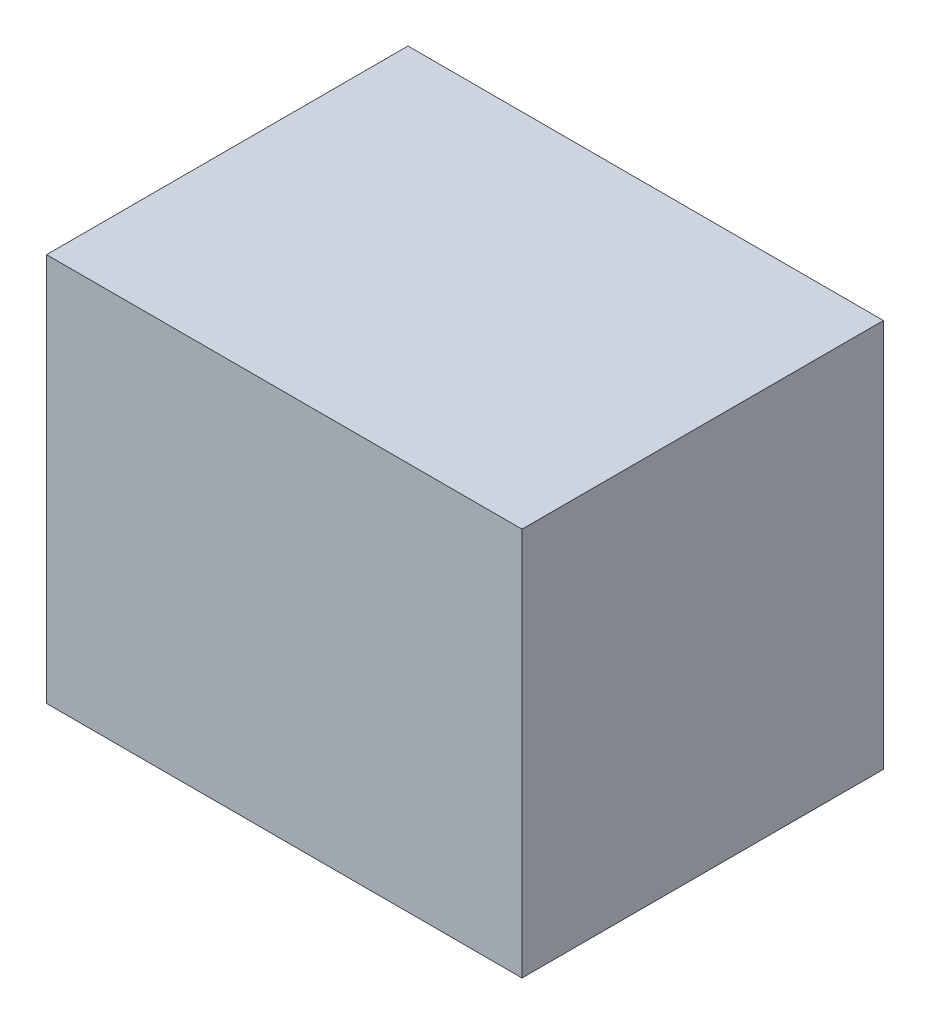
ISO-10303-21;
HEADER;
FILE_DESCRIPTION(('STEP AP214'),'2;1');
FILE_NAME('part.step','',(''),(''),'','','');
FILE_SCHEMA(('AUTOMOTIVE_DESIGN { 1 0 10303 214 1 1 1 1 }'));
ENDSEC;
DATA;
#1=APPLICATION_CONTEXT('core data for automotive mechanical design processes');
#2=APPLICATION_PROTOCOL_DEFINITION('international standard','automotive_design',2000,#1);
#3=PRODUCT_CONTEXT('',#1,'mechanical');
#4=PRODUCT('Part','Part','',(#3));
#5=PRODUCT_RELATED_PRODUCT_CATEGORY('part','',(#4));
#6=PRODUCT_DEFINITION_FORMATION('','',#4);
#7=PRODUCT_DEFINITION_CONTEXT('part definition',#1,'design');
#8=PRODUCT_DEFINITION('design','',#6,#7);
#9=PRODUCT_DEFINITION_SHAPE('','',#8);
#10=(LENGTH_UNIT() NAMED_UNIT(*) SI_UNIT(.MILLI.,.METRE.));
#11=(NAMED_UNIT(*) PLANE_ANGLE_UNIT() SI_UNIT($,.RADIAN.));
#12=(NAMED_UNIT(*) SI_UNIT($,.STERADIAN.) SOLID_ANGLE_UNIT());
#13=UNCERTAINTY_MEASURE_WITH_UNIT(LENGTH_MEASURE(1.E-05),#10,'distance_accuracy_value','');
#14=(GEOMETRIC_REPRESENTATION_CONTEXT(3) GLOBAL_UNCERTAINTY_ASSIGNED_CONTEXT((#13)) GLOBAL_UNIT_ASSIGNED_CONTEXT((#10,
#11,#12)) REPRESENTATION_CONTEXT('',''));
#15=CARTESIAN_POINT('',(0.,0.,0.));
#16=DIRECTION('',(0.,0.,1.));
#17=DIRECTION('',(1.,0.,0.));
#18=AXIS2_PLACEMENT_3D('',#15,#16,#17);
#19=CARTESIAN_POINT('',(214.287747770194,242.,-69.0975551898418));
#20=DIRECTION('',(-1.,0.,0.));
#21=DIRECTION('',(0.,0.,1.));
#22=AXIS2_PLACEMENT_3D('',#19,#20,#21);
#23=PLANE('',#22);
#24=DIRECTION('',(0.,0.,-1.));
#25=VECTOR('',#24,1.);
#26=CARTESIAN_POINT('',(214.287747770194,0.,-69.0975551898418));
#27=LINE('',#26,#25);
#28=CARTESIAN_POINT('',(214.287747770194,0.,155.902444810158));
#29=VERTEX_POINT('',#28);
#30=CARTESIAN_POINT('',(214.287747770194,0.,-69.0975551898418));
#31=VERTEX_POINT('',#30);
#32=EDGE_CURVE('E96',#29,#31,#27,.T.);
#33=ORIENTED_EDGE('',*,*,#32,.T.);
#34=DIRECTION('',(0.,-1.,0.));
#35=VECTOR('',#34,1.);
#36=CARTESIAN_POINT('',(214.287747770194,242.,-69.0975551898418));
#37=LINE('',#36,#35);
#38=CARTESIAN_POINT('',(214.287747770194,242.,-69.0975551898418));
#39=VERTEX_POINT('',#38);
#40=EDGE_CURVE('E11',#39,#31,#37,.T.);
#41=ORIENTED_EDGE('',*,*,#40,.F.);
#42=DIRECTION('',(0.,0.,-1.));
#43=VECTOR('',#42,1.);
#44=CARTESIAN_POINT('',(214.287747770194,242.,-69.0975551898418));
#45=LINE('',#44,#43);
#46=CARTESIAN_POINT('',(214.287747770194,242.,155.902444810158));
#47=VERTEX_POINT('',#46);
#48=EDGE_CURVE('E84',#47,#39,#45,.T.);
#49=ORIENTED_EDGE('',*,*,#48,.F.);
#50=DIRECTION('',(0.,-1.,0.));
#51=VECTOR('',#50,1.);
#52=CARTESIAN_POINT('',(214.287747770194,242.,155.902444810158));
#53=LINE('',#52,#51);
#54=EDGE_CURVE('E92',#47,#29,#53,.T.);
#55=ORIENTED_EDGE('',*,*,#54,.T.);
#56=EDGE_LOOP('',(#33,#41,#49,#55));
#57=FACE_BOUND('',#56,.T.);
#58=ADVANCED_FACE('F33',(#57),#23,.F.);
#59=CARTESIAN_POINT('',(-81.7122522298064,242.,-69.0975551898418));
#60=DIRECTION('',(0.,0.,1.));
#61=DIRECTION('',(1.,0.,0.));
#62=AXIS2_PLACEMENT_3D('',#59,#60,#61);
#63=PLANE('',#62);
#64=DIRECTION('',(-1.,0.,0.));
#65=VECTOR('',#64,1.);
#66=CARTESIAN_POINT('',(-81.7122522298064,0.,-69.0975551898418));
#67=LINE('',#66,#65);
#68=CARTESIAN_POINT('',(-81.7122522298064,0.,-69.0975551898418));
#69=VERTEX_POINT('',#68);
#70=EDGE_CURVE('E88',#31,#69,#67,.T.);
#71=ORIENTED_EDGE('',*,*,#70,.T.);
#72=DIRECTION('',(0.,-1.,0.));
#73=VECTOR('',#72,1.);
#74=CARTESIAN_POINT('',(-81.7122522298064,242.,-69.0975551898418));
#75=LINE('',#74,#73);
#76=CARTESIAN_POINT('',(-81.7122522298064,242.,-69.0975551898418));
#77=VERTEX_POINT('',#76);
#78=EDGE_CURVE('E41',#77,#69,#75,.T.);
#79=ORIENTED_EDGE('',*,*,#78,.F.);
#80=DIRECTION('',(-1.,0.,0.));
#81=VECTOR('',#80,1.);
#82=CARTESIAN_POINT('',(-81.7122522298064,242.,-69.0975551898418));
#83=LINE('',#82,#81);
#84=EDGE_CURVE('E79',#39,#77,#83,.T.);
#85=ORIENTED_EDGE('',*,*,#84,.F.);
#86=ORIENTED_EDGE('',*,*,#40,.T.);
#87=EDGE_LOOP('',(#71,#79,#85,#86));
#88=FACE_BOUND('',#87,.T.);
#89=ADVANCED_FACE('F87',(#88),#63,.F.);
#90=CARTESIAN_POINT('',(-81.7122522298064,242.,-69.0975551898418));
#91=DIRECTION('',(1.,0.,0.));
#92=DIRECTION('',(0.,0.,-1.));
#93=AXIS2_PLACEMENT_3D('',#90,#91,#92);
#94=PLANE('',#93);
#95=DIRECTION('',(0.,0.,1.));
#96=VECTOR('',#95,1.);
#97=CARTESIAN_POINT('',(-81.7122522298064,0.,-69.0975551898418));
#98=LINE('',#97,#96);
#99=CARTESIAN_POINT('',(-81.7122522298064,0.,155.902444810158));
#100=VERTEX_POINT('',#99);
#101=EDGE_CURVE('E66',#69,#100,#98,.T.);
#102=ORIENTED_EDGE('',*,*,#101,.T.);
#103=DIRECTION('',(0.,-1.,0.));
#104=VECTOR('',#103,1.);
#105=CARTESIAN_POINT('',(-81.7122522298064,242.,155.902444810158));
#106=LINE('',#105,#104);
#107=CARTESIAN_POINT('',(-81.7122522298064,242.,155.902444810158));
#108=VERTEX_POINT('',#107);
#109=EDGE_CURVE('E89',#108,#100,#106,.T.);
#110=ORIENTED_EDGE('',*,*,#109,.F.);
#111=DIRECTION('',(0.,0.,1.));
#112=VECTOR('',#111,1.);
#113=CARTESIAN_POINT('',(-81.7122522298064,242.,-69.0975551898418));
#114=LINE('',#113,#112);
#115=EDGE_CURVE('E82',#77,#108,#114,.T.);
#116=ORIENTED_EDGE('',*,*,#115,.F.);
#117=ORIENTED_EDGE('',*,*,#78,.T.);
#118=EDGE_LOOP('',(#102,#110,#116,#117));
#119=FACE_BOUND('',#118,.T.);
#120=ADVANCED_FACE('F90',(#119),#94,.F.);
#121=CARTESIAN_POINT('',(-81.7122522298064,242.,155.902444810158));
#122=DIRECTION('',(0.,0.,-1.));
#123=DIRECTION('',(-1.,0.,0.));
#124=AXIS2_PLACEMENT_3D('',#121,#122,#123);
#125=PLANE('',#124);
#126=DIRECTION('',(1.,0.,0.));
#127=VECTOR('',#126,1.);
#128=CARTESIAN_POINT('',(-81.7122522298064,0.,155.902444810158));
#129=LINE('',#128,#127);
#130=EDGE_CURVE('E72',#100,#29,#129,.T.);
#131=ORIENTED_EDGE('',*,*,#130,.T.);
#132=ORIENTED_EDGE('',*,*,#54,.F.);
#133=DIRECTION('',(1.,0.,0.));
#134=VECTOR('',#133,1.);
#135=CARTESIAN_POINT('',(-81.7122522298064,242.,155.902444810158));
#136=LINE('',#135,#134);
#137=EDGE_CURVE('E49',#108,#47,#136,.T.);
#138=ORIENTED_EDGE('',*,*,#137,.F.);
#139=ORIENTED_EDGE('',*,*,#109,.T.);
#140=EDGE_LOOP('',(#131,#132,#138,#139));
#141=FACE_BOUND('',#140,.T.);
#142=ADVANCED_FACE('F103',(#141),#125,.F.);
#143=CARTESIAN_POINT('',(0.,242.,0.));
#144=DIRECTION('',(0.,1.,0.));
#145=DIRECTION('',(0.,0.,1.));
#146=AXIS2_PLACEMENT_3D('',#143,#144,#145);
#147=PLANE('',#146);
#148=ORIENTED_EDGE('',*,*,#48,.T.);
#149=ORIENTED_EDGE('',*,*,#84,.T.);
#150=ORIENTED_EDGE('',*,*,#115,.T.);
#151=ORIENTED_EDGE('',*,*,#137,.T.);
#152=EDGE_LOOP('',(#148,#149,#150,#151));
#153=FACE_BOUND('',#152,.T.);
#154=ADVANCED_FACE('F80',(#153),#147,.T.);
#155=CARTESIAN_POINT('',(0.,0.,0.));
#156=DIRECTION('',(0.,1.,0.));
#157=DIRECTION('',(0.,0.,1.));
#158=AXIS2_PLACEMENT_3D('',#155,#156,#157);
#159=PLANE('',#158);
#160=ORIENTED_EDGE('',*,*,#32,.F.);
#161=ORIENTED_EDGE('',*,*,#130,.F.);
#162=ORIENTED_EDGE('',*,*,#101,.F.);
#163=ORIENTED_EDGE('',*,*,#70,.F.);
#164=EDGE_LOOP('',(#160,#161,#162,#163));
#165=FACE_BOUND('',#164,.T.);
#166=ADVANCED_FACE('F106',(#165),#159,.F.);
#167=CLOSED_SHELL('',(#58,#89,#120,#142,#154,#166));
#168=MANIFOLD_SOLID_BREP('B2',#167);
#169=ADVANCED_BREP_SHAPE_REPRESENTATION('',(#18,#168),#14);
#170=SHAPE_DEFINITION_REPRESENTATION(#9,#169);
ENDSEC;
END-ISO-10303-21;
